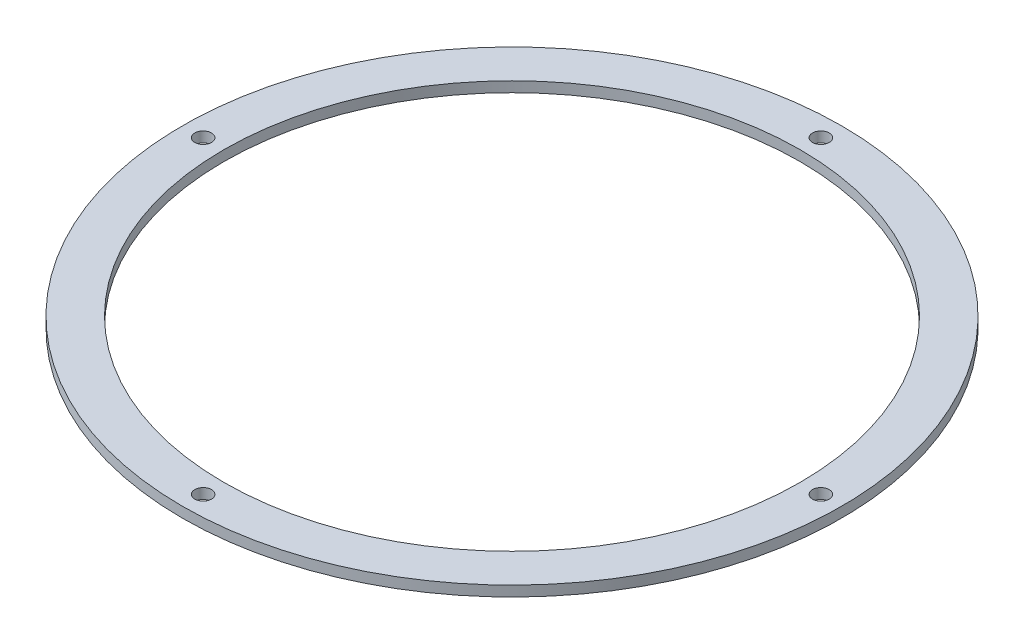
ISO-10303-21;
HEADER;
FILE_DESCRIPTION(('STEP AP214'),'2;1');
FILE_NAME('part.step','',(''),(''),'','','');
FILE_SCHEMA(('AUTOMOTIVE_DESIGN { 1 0 10303 214 1 1 1 1 }'));
ENDSEC;
DATA;
#1=APPLICATION_CONTEXT('core data for automotive mechanical design processes');
#2=APPLICATION_PROTOCOL_DEFINITION('international standard','automotive_design',2000,#1);
#3=PRODUCT_CONTEXT('',#1,'mechanical');
#4=PRODUCT('Part','Part','',(#3));
#5=PRODUCT_RELATED_PRODUCT_CATEGORY('part','',(#4));
#6=PRODUCT_DEFINITION_FORMATION('','',#4);
#7=PRODUCT_DEFINITION_CONTEXT('part definition',#1,'design');
#8=PRODUCT_DEFINITION('design','',#6,#7);
#9=PRODUCT_DEFINITION_SHAPE('','',#8);
#10=(LENGTH_UNIT() NAMED_UNIT(*) SI_UNIT(.MILLI.,.METRE.));
#11=(NAMED_UNIT(*) PLANE_ANGLE_UNIT() SI_UNIT($,.RADIAN.));
#12=(NAMED_UNIT(*) SI_UNIT($,.STERADIAN.) SOLID_ANGLE_UNIT());
#13=UNCERTAINTY_MEASURE_WITH_UNIT(LENGTH_MEASURE(1.E-05),#10,'distance_accuracy_value','');
#14=(GEOMETRIC_REPRESENTATION_CONTEXT(3) GLOBAL_UNCERTAINTY_ASSIGNED_CONTEXT((#13)) GLOBAL_UNIT_ASSIGNED_CONTEXT((#10,
#11,#12)) REPRESENTATION_CONTEXT('',''));
#15=CARTESIAN_POINT('',(0.,0.,0.));
#16=DIRECTION('',(0.,0.,1.));
#17=DIRECTION('',(1.,0.,0.));
#18=AXIS2_PLACEMENT_3D('',#15,#16,#17);
#19=CARTESIAN_POINT('',(0.,3.175,0.));
#20=DIRECTION('',(0.,1.,0.));
#21=DIRECTION('',(0.,0.,1.));
#22=AXIS2_PLACEMENT_3D('',#19,#20,#21);
#23=PLANE('',#22);
#24=CARTESIAN_POINT('',(0.,3.175,-94.749999984));
#25=DIRECTION('',(0.,1.,0.));
#26=DIRECTION('',(0.,0.,1.));
#27=AXIS2_PLACEMENT_3D('',#24,#25,#26);
#28=CIRCLE('',#27,2.5527);
#29=CARTESIAN_POINT('',(0.,3.175,-92.197299984));
#30=VERTEX_POINT('',#29);
#31=EDGE_CURVE('E65',#30,#30,#28,.T.);
#32=ORIENTED_EDGE('',*,*,#31,.F.);
#33=EDGE_LOOP('',(#32));
#34=FACE_BOUND('',#33,.T.);
#35=CARTESIAN_POINT('',(0.,3.175,94.749999984));
#36=DIRECTION('',(0.,1.,0.));
#37=DIRECTION('',(0.,0.,1.));
#38=AXIS2_PLACEMENT_3D('',#35,#36,#37);
#39=CIRCLE('',#38,2.5527);
#40=CARTESIAN_POINT('',(0.,3.175,97.302699984));
#41=VERTEX_POINT('',#40);
#42=EDGE_CURVE('E53',#41,#41,#39,.T.);
#43=ORIENTED_EDGE('',*,*,#42,.F.);
#44=EDGE_LOOP('',(#43));
#45=FACE_BOUND('',#44,.T.);
#46=CARTESIAN_POINT('',(0.,3.175,0.));
#47=DIRECTION('',(0.,1.,0.));
#48=DIRECTION('',(0.,0.,1.));
#49=AXIS2_PLACEMENT_3D('',#46,#47,#48);
#50=CIRCLE('',#49,101.099999984);
#51=CARTESIAN_POINT('',(0.,3.175,101.099999984));
#52=VERTEX_POINT('',#51);
#53=EDGE_CURVE('E10',#52,#52,#50,.T.);
#54=ORIENTED_EDGE('',*,*,#53,.T.);
#55=EDGE_LOOP('',(#54));
#56=FACE_BOUND('',#55,.T.);
#57=CARTESIAN_POINT('',(0.,3.175,0.));
#58=DIRECTION('',(0.,1.,0.));
#59=DIRECTION('',(0.,0.,1.));
#60=AXIS2_PLACEMENT_3D('',#57,#58,#59);
#61=CIRCLE('',#60,88.399999984);
#62=CARTESIAN_POINT('',(0.,3.175,88.399999984));
#63=VERTEX_POINT('',#62);
#64=EDGE_CURVE('E48',#63,#63,#61,.T.);
#65=ORIENTED_EDGE('',*,*,#64,.F.);
#66=EDGE_LOOP('',(#65));
#67=FACE_BOUND('',#66,.T.);
#68=CARTESIAN_POINT('',(-94.749999984,3.175,0.));
#69=DIRECTION('',(0.,1.,0.));
#70=DIRECTION('',(0.,0.,1.));
#71=AXIS2_PLACEMENT_3D('',#68,#69,#70);
#72=CIRCLE('',#71,2.5527);
#73=CARTESIAN_POINT('',(-94.749999984,3.175,2.5527));
#74=VERTEX_POINT('',#73);
#75=EDGE_CURVE('E59',#74,#74,#72,.T.);
#76=ORIENTED_EDGE('',*,*,#75,.F.);
#77=EDGE_LOOP('',(#76));
#78=FACE_BOUND('',#77,.T.);
#79=CARTESIAN_POINT('',(94.749999984,3.175,0.));
#80=DIRECTION('',(0.,1.,0.));
#81=DIRECTION('',(0.,0.,1.));
#82=AXIS2_PLACEMENT_3D('',#79,#80,#81);
#83=CIRCLE('',#82,2.5527);
#84=CARTESIAN_POINT('',(94.749999984,3.175,2.55270000000001));
#85=VERTEX_POINT('',#84);
#86=EDGE_CURVE('E71',#85,#85,#83,.T.);
#87=ORIENTED_EDGE('',*,*,#86,.F.);
#88=EDGE_LOOP('',(#87));
#89=FACE_BOUND('',#88,.T.);
#90=ADVANCED_FACE('F37',(#34,#45,#56,#67,#78,#89),#23,.T.);
#91=CARTESIAN_POINT('',(0.,0.,0.));
#92=DIRECTION('',(0.,1.,0.));
#93=DIRECTION('',(0.,0.,1.));
#94=AXIS2_PLACEMENT_3D('',#91,#92,#93);
#95=PLANE('',#94);
#96=CARTESIAN_POINT('',(0.,0.,0.));
#97=DIRECTION('',(0.,1.,0.));
#98=DIRECTION('',(0.,0.,1.));
#99=AXIS2_PLACEMENT_3D('',#96,#97,#98);
#100=CIRCLE('',#99,101.099999984);
#101=CARTESIAN_POINT('',(0.,0.,101.099999984));
#102=VERTEX_POINT('',#101);
#103=EDGE_CURVE('E41',#102,#102,#100,.T.);
#104=ORIENTED_EDGE('',*,*,#103,.F.);
#105=EDGE_LOOP('',(#104));
#106=FACE_BOUND('',#105,.T.);
#107=CARTESIAN_POINT('',(0.,0.,0.));
#108=DIRECTION('',(0.,1.,0.));
#109=DIRECTION('',(0.,0.,1.));
#110=AXIS2_PLACEMENT_3D('',#107,#108,#109);
#111=CIRCLE('',#110,88.399999984);
#112=CARTESIAN_POINT('',(0.,0.,88.399999984));
#113=VERTEX_POINT('',#112);
#114=EDGE_CURVE('E50',#113,#113,#111,.T.);
#115=ORIENTED_EDGE('',*,*,#114,.T.);
#116=EDGE_LOOP('',(#115));
#117=FACE_BOUND('',#116,.T.);
#118=CARTESIAN_POINT('',(0.,0.,94.749999984));
#119=DIRECTION('',(0.,1.,0.));
#120=DIRECTION('',(0.,0.,1.));
#121=AXIS2_PLACEMENT_3D('',#118,#119,#120);
#122=CIRCLE('',#121,2.5527);
#123=CARTESIAN_POINT('',(0.,0.,97.302699984));
#124=VERTEX_POINT('',#123);
#125=EDGE_CURVE('E56',#124,#124,#122,.T.);
#126=ORIENTED_EDGE('',*,*,#125,.T.);
#127=EDGE_LOOP('',(#126));
#128=FACE_BOUND('',#127,.T.);
#129=CARTESIAN_POINT('',(-94.749999984,0.,0.));
#130=DIRECTION('',(0.,1.,0.));
#131=DIRECTION('',(0.,0.,1.));
#132=AXIS2_PLACEMENT_3D('',#129,#130,#131);
#133=CIRCLE('',#132,2.5527);
#134=CARTESIAN_POINT('',(-94.749999984,0.,2.5527));
#135=VERTEX_POINT('',#134);
#136=EDGE_CURVE('E62',#135,#135,#133,.T.);
#137=ORIENTED_EDGE('',*,*,#136,.T.);
#138=EDGE_LOOP('',(#137));
#139=FACE_BOUND('',#138,.T.);
#140=CARTESIAN_POINT('',(0.,0.,-94.749999984));
#141=DIRECTION('',(0.,1.,0.));
#142=DIRECTION('',(0.,0.,1.));
#143=AXIS2_PLACEMENT_3D('',#140,#141,#142);
#144=CIRCLE('',#143,2.5527);
#145=CARTESIAN_POINT('',(0.,0.,-92.197299984));
#146=VERTEX_POINT('',#145);
#147=EDGE_CURVE('E68',#146,#146,#144,.T.);
#148=ORIENTED_EDGE('',*,*,#147,.T.);
#149=EDGE_LOOP('',(#148));
#150=FACE_BOUND('',#149,.T.);
#151=CARTESIAN_POINT('',(94.749999984,0.,0.));
#152=DIRECTION('',(0.,1.,0.));
#153=DIRECTION('',(0.,0.,1.));
#154=AXIS2_PLACEMENT_3D('',#151,#152,#153);
#155=CIRCLE('',#154,2.5527);
#156=CARTESIAN_POINT('',(94.749999984,0.,2.55270000000001));
#157=VERTEX_POINT('',#156);
#158=EDGE_CURVE('E74',#157,#157,#155,.T.);
#159=ORIENTED_EDGE('',*,*,#158,.T.);
#160=EDGE_LOOP('',(#159));
#161=FACE_BOUND('',#160,.T.);
#162=ADVANCED_FACE('F84',(#106,#117,#128,#139,#150,#161),#95,.F.);
#163=CARTESIAN_POINT('',(0.,3.175,0.));
#164=DIRECTION('',(0.,-1.,0.));
#165=DIRECTION('',(0.,0.,-1.));
#166=AXIS2_PLACEMENT_3D('',#163,#164,#165);
#167=CYLINDRICAL_SURFACE('',#166,101.099999984);
#168=ORIENTED_EDGE('',*,*,#53,.F.);
#169=EDGE_LOOP('',(#168));
#170=FACE_BOUND('',#169,.T.);
#171=ORIENTED_EDGE('',*,*,#103,.T.);
#172=EDGE_LOOP('',(#171));
#173=FACE_BOUND('',#172,.T.);
#174=ADVANCED_FACE('F39',(#170,#173),#167,.T.);
#175=CARTESIAN_POINT('',(0.,3.175,0.));
#176=DIRECTION('',(0.,-1.,0.));
#177=DIRECTION('',(0.,0.,-1.));
#178=AXIS2_PLACEMENT_3D('',#175,#176,#177);
#179=CYLINDRICAL_SURFACE('',#178,88.399999984);
#180=ORIENTED_EDGE('',*,*,#64,.T.);
#181=EDGE_LOOP('',(#180));
#182=FACE_BOUND('',#181,.T.);
#183=ORIENTED_EDGE('',*,*,#114,.F.);
#184=EDGE_LOOP('',(#183));
#185=FACE_BOUND('',#184,.T.);
#186=ADVANCED_FACE('F94',(#182,#185),#179,.F.);
#187=CARTESIAN_POINT('',(0.,3.175,94.749999984));
#188=DIRECTION('',(0.,-1.,0.));
#189=DIRECTION('',(0.,0.,-1.));
#190=AXIS2_PLACEMENT_3D('',#187,#188,#189);
#191=CYLINDRICAL_SURFACE('',#190,2.5527);
#192=ORIENTED_EDGE('',*,*,#42,.T.);
#193=EDGE_LOOP('',(#192));
#194=FACE_BOUND('',#193,.T.);
#195=ORIENTED_EDGE('',*,*,#125,.F.);
#196=EDGE_LOOP('',(#195));
#197=FACE_BOUND('',#196,.T.);
#198=ADVANCED_FACE('F97',(#194,#197),#191,.F.);
#199=CARTESIAN_POINT('',(-94.749999984,3.175,0.));
#200=DIRECTION('',(0.,-1.,0.));
#201=DIRECTION('',(0.,0.,-1.));
#202=AXIS2_PLACEMENT_3D('',#199,#200,#201);
#203=CYLINDRICAL_SURFACE('',#202,2.5527);
#204=ORIENTED_EDGE('',*,*,#75,.T.);
#205=EDGE_LOOP('',(#204));
#206=FACE_BOUND('',#205,.T.);
#207=ORIENTED_EDGE('',*,*,#136,.F.);
#208=EDGE_LOOP('',(#207));
#209=FACE_BOUND('',#208,.T.);
#210=ADVANCED_FACE('F101',(#206,#209),#203,.F.);
#211=CARTESIAN_POINT('',(0.,3.175,-94.749999984));
#212=DIRECTION('',(0.,-1.,0.));
#213=DIRECTION('',(0.,0.,-1.));
#214=AXIS2_PLACEMENT_3D('',#211,#212,#213);
#215=CYLINDRICAL_SURFACE('',#214,2.5527);
#216=ORIENTED_EDGE('',*,*,#31,.T.);
#217=EDGE_LOOP('',(#216));
#218=FACE_BOUND('',#217,.T.);
#219=ORIENTED_EDGE('',*,*,#147,.F.);
#220=EDGE_LOOP('',(#219));
#221=FACE_BOUND('',#220,.T.);
#222=ADVANCED_FACE('F105',(#218,#221),#215,.F.);
#223=CARTESIAN_POINT('',(94.749999984,3.175,0.));
#224=DIRECTION('',(0.,-1.,0.));
#225=DIRECTION('',(0.,0.,-1.));
#226=AXIS2_PLACEMENT_3D('',#223,#224,#225);
#227=CYLINDRICAL_SURFACE('',#226,2.5527);
#228=ORIENTED_EDGE('',*,*,#86,.T.);
#229=EDGE_LOOP('',(#228));
#230=FACE_BOUND('',#229,.T.);
#231=ORIENTED_EDGE('',*,*,#158,.F.);
#232=EDGE_LOOP('',(#231));
#233=FACE_BOUND('',#232,.T.);
#234=ADVANCED_FACE('F80',(#230,#233),#227,.F.);
#235=CLOSED_SHELL('',(#90,#162,#174,#186,#198,#210,#222,#234));
#236=MANIFOLD_SOLID_BREP('B2',#235);
#237=ADVANCED_BREP_SHAPE_REPRESENTATION('',(#18,#236),#14);
#238=SHAPE_DEFINITION_REPRESENTATION(#9,#237);
ENDSEC;
END-ISO-10303-21;
